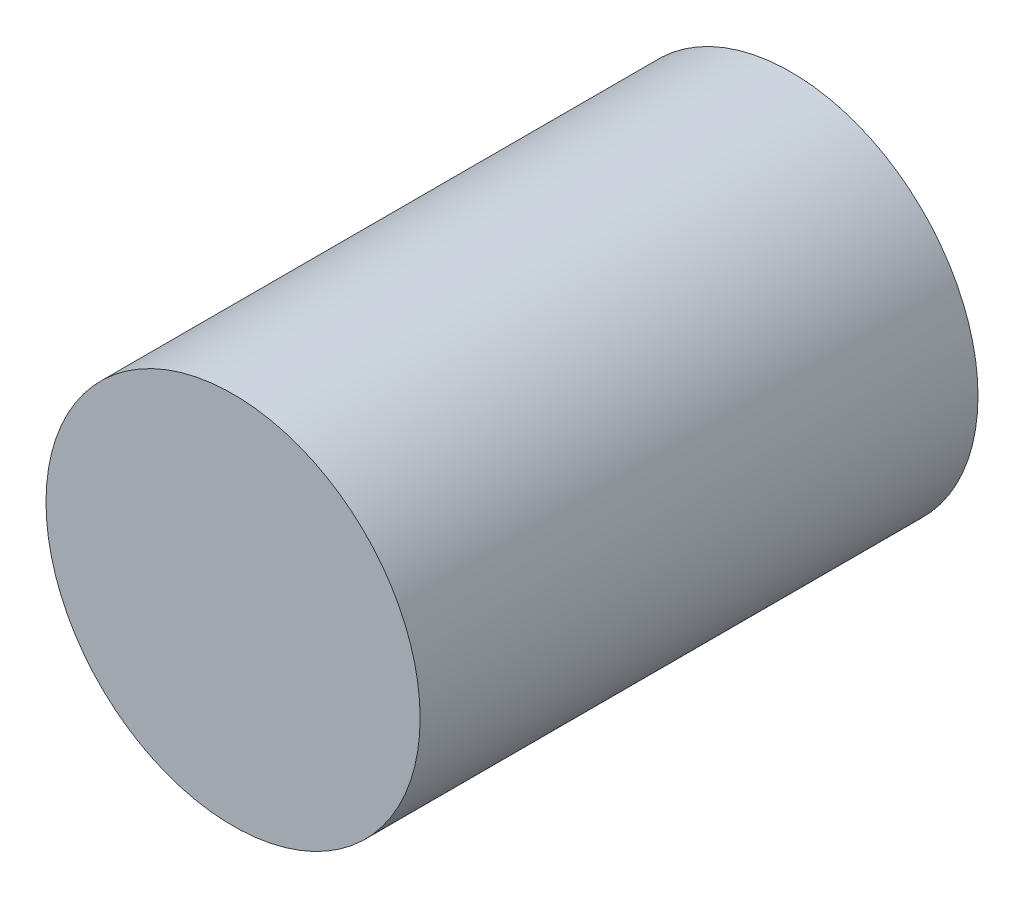
ISO-10303-21;
HEADER;
FILE_DESCRIPTION(('STEP AP214'),'2;1');
FILE_NAME('part.step','',(''),(''),'','','');
FILE_SCHEMA(('AUTOMOTIVE_DESIGN { 1 0 10303 214 1 1 1 1 }'));
ENDSEC;
DATA;
#1=APPLICATION_CONTEXT('core data for automotive mechanical design processes');
#2=APPLICATION_PROTOCOL_DEFINITION('international standard','automotive_design',2000,#1);
#3=PRODUCT_CONTEXT('',#1,'mechanical');
#4=PRODUCT('Part','Part','',(#3));
#5=PRODUCT_RELATED_PRODUCT_CATEGORY('part','',(#4));
#6=PRODUCT_DEFINITION_FORMATION('','',#4);
#7=PRODUCT_DEFINITION_CONTEXT('part definition',#1,'design');
#8=PRODUCT_DEFINITION('design','',#6,#7);
#9=PRODUCT_DEFINITION_SHAPE('','',#8);
#10=(LENGTH_UNIT() NAMED_UNIT(*) SI_UNIT(.MILLI.,.METRE.));
#11=(NAMED_UNIT(*) PLANE_ANGLE_UNIT() SI_UNIT($,.RADIAN.));
#12=(NAMED_UNIT(*) SI_UNIT($,.STERADIAN.) SOLID_ANGLE_UNIT());
#13=UNCERTAINTY_MEASURE_WITH_UNIT(LENGTH_MEASURE(1.E-05),#10,'distance_accuracy_value','');
#14=(GEOMETRIC_REPRESENTATION_CONTEXT(3) GLOBAL_UNCERTAINTY_ASSIGNED_CONTEXT((#13)) GLOBAL_UNIT_ASSIGNED_CONTEXT((#10,
#11,#12)) REPRESENTATION_CONTEXT('',''));
#15=CARTESIAN_POINT('',(0.,0.,0.));
#16=DIRECTION('',(0.,0.,1.));
#17=DIRECTION('',(1.,0.,0.));
#18=AXIS2_PLACEMENT_3D('',#15,#16,#17);
#19=CARTESIAN_POINT('',(0.,0.,54.8));
#20=DIRECTION('',(0.,0.,-1.));
#21=DIRECTION('',(-1.,0.,0.));
#22=AXIS2_PLACEMENT_3D('',#19,#20,#21);
#23=CYLINDRICAL_SURFACE('',#22,18.375);
#24=CARTESIAN_POINT('',(0.,0.,54.8));
#25=DIRECTION('',(0.,0.,1.));
#26=DIRECTION('',(1.,0.,0.));
#27=AXIS2_PLACEMENT_3D('',#24,#25,#26);
#28=CIRCLE('',#27,18.375);
#29=CARTESIAN_POINT('',(-18.375,0.,54.8));
#30=VERTEX_POINT('',#29);
#31=EDGE_CURVE('E10',#30,#30,#28,.T.);
#32=CARTESIAN_POINT('',(0.,0.,0.));
#33=DIRECTION('',(0.,0.,1.));
#34=DIRECTION('',(1.,0.,0.));
#35=AXIS2_PLACEMENT_3D('',#32,#33,#34);
#36=CIRCLE('',#35,18.375);
#37=CARTESIAN_POINT('',(-18.375,0.,0.));
#38=VERTEX_POINT('',#37);
#39=EDGE_CURVE('E40',#38,#38,#36,.T.);
#40=CARTESIAN_POINT('',(-18.375,0.,54.8));
#41=CARTESIAN_POINT('',(-18.375,0.,54.2291666666667));
#42=CARTESIAN_POINT('',(-18.375,0.,53.6583333333333));
#43=CARTESIAN_POINT('',(-18.375,0.,52.5166666666667));
#44=CARTESIAN_POINT('',(-18.375,0.,51.9458333333333));
#45=CARTESIAN_POINT('',(-18.375,0.,50.8041666666667));
#46=CARTESIAN_POINT('',(-18.375,0.,50.2333333333333));
#47=CARTESIAN_POINT('',(-18.375,0.,49.0916666666667));
#48=CARTESIAN_POINT('',(-18.375,0.,48.5208333333333));
#49=CARTESIAN_POINT('',(-18.375,0.,47.3791666666667));
#50=CARTESIAN_POINT('',(-18.375,0.,46.8083333333333));
#51=CARTESIAN_POINT('',(-18.375,0.,45.6666666666667));
#52=CARTESIAN_POINT('',(-18.375,0.,45.0958333333333));
#53=CARTESIAN_POINT('',(-18.375,0.,43.9541666666667));
#54=CARTESIAN_POINT('',(-18.375,0.,43.3833333333333));
#55=CARTESIAN_POINT('',(-18.375,0.,42.2416666666667));
#56=CARTESIAN_POINT('',(-18.375,0.,41.6708333333333));
#57=CARTESIAN_POINT('',(-18.375,0.,40.5291666666667));
#58=CARTESIAN_POINT('',(-18.375,0.,39.9583333333333));
#59=CARTESIAN_POINT('',(-18.375,0.,38.8166666666667));
#60=CARTESIAN_POINT('',(-18.375,0.,38.2458333333333));
#61=CARTESIAN_POINT('',(-18.375,0.,37.1041666666667));
#62=CARTESIAN_POINT('',(-18.375,0.,36.5333333333333));
#63=CARTESIAN_POINT('',(-18.375,0.,35.3916666666667));
#64=CARTESIAN_POINT('',(-18.375,0.,34.8208333333333));
#65=CARTESIAN_POINT('',(-18.375,0.,33.6791666666667));
#66=CARTESIAN_POINT('',(-18.375,0.,33.1083333333333));
#67=CARTESIAN_POINT('',(-18.375,0.,31.9666666666667));
#68=CARTESIAN_POINT('',(-18.375,0.,31.3958333333333));
#69=CARTESIAN_POINT('',(-18.375,0.,30.2541666666667));
#70=CARTESIAN_POINT('',(-18.375,0.,29.6833333333333));
#71=CARTESIAN_POINT('',(-18.375,0.,28.5416666666667));
#72=CARTESIAN_POINT('',(-18.375,0.,27.9708333333333));
#73=CARTESIAN_POINT('',(-18.375,0.,26.8291666666667));
#74=CARTESIAN_POINT('',(-18.375,0.,26.2583333333333));
#75=CARTESIAN_POINT('',(-18.375,0.,25.1166666666667));
#76=CARTESIAN_POINT('',(-18.375,0.,24.5458333333333));
#77=CARTESIAN_POINT('',(-18.375,0.,23.4041666666667));
#78=CARTESIAN_POINT('',(-18.375,0.,22.8333333333333));
#79=CARTESIAN_POINT('',(-18.375,0.,21.6916666666667));
#80=CARTESIAN_POINT('',(-18.375,0.,21.1208333333333));
#81=CARTESIAN_POINT('',(-18.375,0.,19.9791666666667));
#82=CARTESIAN_POINT('',(-18.375,0.,19.4083333333333));
#83=CARTESIAN_POINT('',(-18.375,0.,18.2666666666667));
#84=CARTESIAN_POINT('',(-18.375,0.,17.6958333333333));
#85=CARTESIAN_POINT('',(-18.375,0.,16.5541666666667));
#86=CARTESIAN_POINT('',(-18.375,0.,15.9833333333333));
#87=CARTESIAN_POINT('',(-18.375,0.,14.8416666666667));
#88=CARTESIAN_POINT('',(-18.375,0.,14.2708333333333));
#89=CARTESIAN_POINT('',(-18.375,0.,13.1291666666667));
#90=CARTESIAN_POINT('',(-18.375,0.,12.5583333333333));
#91=CARTESIAN_POINT('',(-18.375,0.,11.4166666666667));
#92=CARTESIAN_POINT('',(-18.375,0.,10.8458333333333));
#93=CARTESIAN_POINT('',(-18.375,0.,9.70416666666667));
#94=CARTESIAN_POINT('',(-18.375,0.,9.13333333333333));
#95=CARTESIAN_POINT('',(-18.375,0.,7.99166666666667));
#96=CARTESIAN_POINT('',(-18.375,0.,7.42083333333334));
#97=CARTESIAN_POINT('',(-18.375,0.,6.27916666666667));
#98=CARTESIAN_POINT('',(-18.375,0.,5.70833333333333));
#99=CARTESIAN_POINT('',(-18.375,0.,4.56666666666666));
#100=CARTESIAN_POINT('',(-18.375,0.,3.99583333333333));
#101=CARTESIAN_POINT('',(-18.375,0.,2.85416666666666));
#102=CARTESIAN_POINT('',(-18.375,0.,2.28333333333333));
#103=CARTESIAN_POINT('',(-18.375,0.,1.14166666666667));
#104=CARTESIAN_POINT('',(-18.375,0.,0.570833333333333));
#105=CARTESIAN_POINT('',(-18.375,0.,0.));
#106=B_SPLINE_CURVE_WITH_KNOTS('',3,(#40,#41,#42,#43,#44,#45,#46,#47,#48,#49,#50,#51,#52,#53,
#54,#55,#56,#57,#58,#59,#60,#61,#62,#63,#64,#65,#66,#67,#68,#69,#70,#71,#72,#73,#74,#75,#76,#77,
#78,#79,#80,#81,#82,#83,#84,#85,#86,#87,#88,#89,#90,#91,#92,#93,#94,#95,#96,#97,#98,#99,#100,
#101,#102,#103,#104,#105),.UNSPECIFIED.,.F.,.F.,(4,2,2,2,2,2,2,2,2,2,2,2,2,2,2,2,2,2,2,2,2,2,2,
2,2,2,2,2,2,2,2,2,4),(0.,1.7125,3.425,5.1375,6.85,8.56249999999999,10.275,11.9875,13.7,15.4125,
17.125,18.8375,20.55,22.2625,23.975,25.6875,27.4,29.1125,30.825,32.5375,34.25,35.9625,37.675,
39.3875,41.1,42.8125,44.525,46.2375,47.95,49.6625,51.375,53.0875,54.8),.UNSPECIFIED.);
#107=EDGE_CURVE('BSEAM37',#30,#38,#106,.T.);
#108=ORIENTED_EDGE('',*,*,#31,.F.);
#109=ORIENTED_EDGE('',*,*,#39,.T.);
#110=ORIENTED_EDGE('',*,*,#107,.T.);
#111=ORIENTED_EDGE('',*,*,#107,.F.);
#112=EDGE_LOOP('',(#108,#110,#109,#111));
#113=FACE_BOUND('',#112,.T.);
#114=ADVANCED_FACE('F37',(#113),#23,.T.);
#115=CARTESIAN_POINT('',(0.,0.,54.8));
#116=DIRECTION('',(0.,0.,1.));
#117=DIRECTION('',(1.,0.,0.));
#118=AXIS2_PLACEMENT_3D('',#115,#116,#117);
#119=PLANE('',#118);
#120=ORIENTED_EDGE('',*,*,#31,.T.);
#121=EDGE_LOOP('',(#120));
#122=FACE_BOUND('',#121,.T.);
#123=ADVANCED_FACE('F52',(#122),#119,.T.);
#124=CARTESIAN_POINT('',(0.,0.,0.));
#125=DIRECTION('',(0.,0.,1.));
#126=DIRECTION('',(1.,0.,0.));
#127=AXIS2_PLACEMENT_3D('',#124,#125,#126);
#128=PLANE('',#127);
#129=ORIENTED_EDGE('',*,*,#39,.F.);
#130=EDGE_LOOP('',(#129));
#131=FACE_BOUND('',#130,.T.);
#132=ADVANCED_FACE('F50',(#131),#128,.F.);
#133=CLOSED_SHELL('',(#114,#123,#132));
#134=MANIFOLD_SOLID_BREP('B2',#133);
#135=ADVANCED_BREP_SHAPE_REPRESENTATION('',(#18,#134),#14);
#136=SHAPE_DEFINITION_REPRESENTATION(#9,#135);
ENDSEC;
END-ISO-10303-21;
